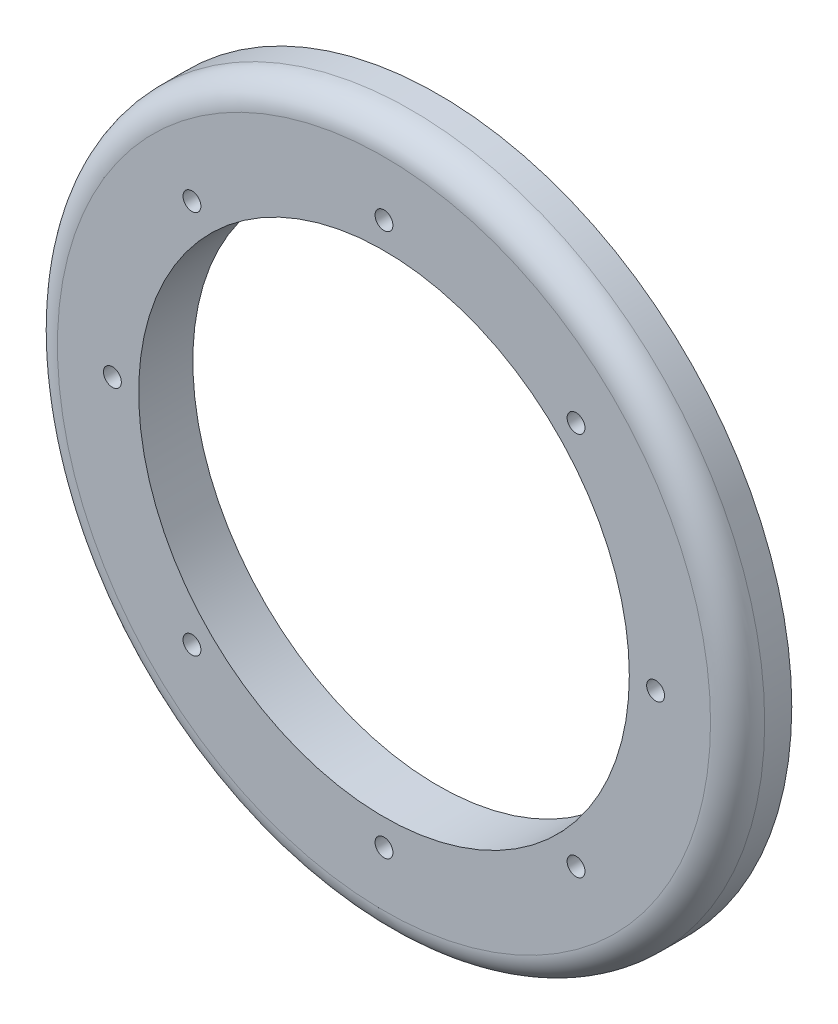
ISO-10303-21;
HEADER;
FILE_DESCRIPTION(('STEP AP214'),'2;1');
FILE_NAME('part.step','',(''),(''),'','','');
FILE_SCHEMA(('AUTOMOTIVE_DESIGN { 1 0 10303 214 1 1 1 1 }'));
ENDSEC;
DATA;
#1=APPLICATION_CONTEXT('core data for automotive mechanical design processes');
#2=APPLICATION_PROTOCOL_DEFINITION('international standard','automotive_design',2000,#1);
#3=PRODUCT_CONTEXT('',#1,'mechanical');
#4=PRODUCT('Part','Part','',(#3));
#5=PRODUCT_RELATED_PRODUCT_CATEGORY('part','',(#4));
#6=PRODUCT_DEFINITION_FORMATION('','',#4);
#7=PRODUCT_DEFINITION_CONTEXT('part definition',#1,'design');
#8=PRODUCT_DEFINITION('design','',#6,#7);
#9=PRODUCT_DEFINITION_SHAPE('','',#8);
#10=(LENGTH_UNIT() NAMED_UNIT(*) SI_UNIT(.MILLI.,.METRE.));
#11=(NAMED_UNIT(*) PLANE_ANGLE_UNIT() SI_UNIT($,.RADIAN.));
#12=(NAMED_UNIT(*) SI_UNIT($,.STERADIAN.) SOLID_ANGLE_UNIT());
#13=UNCERTAINTY_MEASURE_WITH_UNIT(LENGTH_MEASURE(1.E-05),#10,'distance_accuracy_value','');
#14=(GEOMETRIC_REPRESENTATION_CONTEXT(3) GLOBAL_UNCERTAINTY_ASSIGNED_CONTEXT((#13)) GLOBAL_UNIT_ASSIGNED_CONTEXT((#10,
#11,#12)) REPRESENTATION_CONTEXT('',''));
#15=CARTESIAN_POINT('',(0.,0.,0.));
#16=DIRECTION('',(0.,0.,1.));
#17=DIRECTION('',(1.,0.,0.));
#18=AXIS2_PLACEMENT_3D('',#15,#16,#17);
#19=CARTESIAN_POINT('',(0.,0.,10.));
#20=DIRECTION('',(0.,0.,1.));
#21=DIRECTION('',(1.,0.,0.));
#22=AXIS2_PLACEMENT_3D('',#19,#20,#21);
#23=PLANE('',#22);
#24=CARTESIAN_POINT('',(0.,0.,10.));
#25=DIRECTION('',(0.,0.,1.));
#26=DIRECTION('',(1.,0.,0.));
#27=AXIS2_PLACEMENT_3D('',#24,#25,#26);
#28=CIRCLE('',#27,60.3);
#29=CARTESIAN_POINT('',(60.3,0.,10.));
#30=VERTEX_POINT('',#29);
#31=EDGE_CURVE('E42',#30,#30,#28,.T.);
#32=ORIENTED_EDGE('',*,*,#31,.T.);
#33=EDGE_LOOP('',(#32));
#34=FACE_BOUND('',#33,.T.);
#35=CARTESIAN_POINT('',(35.461405076506,35.4614050765047,10.));
#36=DIRECTION('',(0.,0.,1.));
#37=DIRECTION('',(1.,0.,0.));
#38=AXIS2_PLACEMENT_3D('',#35,#36,#37);
#39=CIRCLE('',#38,1.65);
#40=CARTESIAN_POINT('',(37.111405076506,35.4614050765047,10.));
#41=VERTEX_POINT('',#40);
#42=EDGE_CURVE('E92',#41,#41,#39,.T.);
#43=ORIENTED_EDGE('',*,*,#42,.F.);
#44=EDGE_LOOP('',(#43));
#45=FACE_BOUND('',#44,.T.);
#46=CARTESIAN_POINT('',(-35.4614050765048,35.4614050765059,10.));
#47=DIRECTION('',(0.,0.,1.));
#48=DIRECTION('',(1.,0.,0.));
#49=AXIS2_PLACEMENT_3D('',#46,#47,#48);
#50=CIRCLE('',#49,1.65000000000001);
#51=CARTESIAN_POINT('',(-33.8114050765048,35.4614050765059,10.));
#52=VERTEX_POINT('',#51);
#53=EDGE_CURVE('E80',#52,#52,#50,.T.);
#54=ORIENTED_EDGE('',*,*,#53,.F.);
#55=EDGE_LOOP('',(#54));
#56=FACE_BOUND('',#55,.T.);
#57=CARTESIAN_POINT('',(-35.4614050765058,-35.4614050765049,10.));
#58=DIRECTION('',(0.,0.,1.));
#59=DIRECTION('',(1.,0.,0.));
#60=AXIS2_PLACEMENT_3D('',#57,#58,#59);
#61=CIRCLE('',#60,1.65);
#62=CARTESIAN_POINT('',(-33.8114050765058,-35.4614050765049,10.));
#63=VERTEX_POINT('',#62);
#64=EDGE_CURVE('E68',#63,#63,#61,.T.);
#65=ORIENTED_EDGE('',*,*,#64,.F.);
#66=EDGE_LOOP('',(#65));
#67=FACE_BOUND('',#66,.T.);
#68=CARTESIAN_POINT('',(35.4614050765051,-35.4614050765057,10.));
#69=DIRECTION('',(0.,0.,1.));
#70=DIRECTION('',(1.,0.,0.));
#71=AXIS2_PLACEMENT_3D('',#68,#69,#70);
#72=CIRCLE('',#71,1.65);
#73=CARTESIAN_POINT('',(37.1114050765051,-35.4614050765057,10.));
#74=VERTEX_POINT('',#73);
#75=EDGE_CURVE('E56',#74,#74,#72,.T.);
#76=ORIENTED_EDGE('',*,*,#75,.F.);
#77=EDGE_LOOP('',(#76));
#78=FACE_BOUND('',#77,.T.);
#79=CARTESIAN_POINT('',(0.,0.,10.));
#80=DIRECTION('',(0.,0.,1.));
#81=DIRECTION('',(1.,0.,0.));
#82=AXIS2_PLACEMENT_3D('',#79,#80,#81);
#83=CIRCLE('',#82,45.3);
#84=CARTESIAN_POINT('',(45.3,0.,10.));
#85=VERTEX_POINT('',#84);
#86=EDGE_CURVE('E50',#85,#85,#83,.T.);
#87=ORIENTED_EDGE('',*,*,#86,.F.);
#88=EDGE_LOOP('',(#87));
#89=FACE_BOUND('',#88,.T.);
#90=CARTESIAN_POINT('',(-5.20417042793042E-13,-50.15,10.));
#91=DIRECTION('',(0.,0.,1.));
#92=DIRECTION('',(1.,0.,0.));
#93=AXIS2_PLACEMENT_3D('',#90,#91,#92);
#94=CIRCLE('',#93,1.65);
#95=CARTESIAN_POINT('',(1.64999999999948,-50.15,10.));
#96=VERTEX_POINT('',#95);
#97=EDGE_CURVE('E62',#96,#96,#94,.T.);
#98=ORIENTED_EDGE('',*,*,#97,.F.);
#99=EDGE_LOOP('',(#98));
#100=FACE_BOUND('',#99,.T.);
#101=CARTESIAN_POINT('',(-50.15,6.90419943438769E-13,10.));
#102=DIRECTION('',(0.,0.,1.));
#103=DIRECTION('',(1.,0.,0.));
#104=AXIS2_PLACEMENT_3D('',#101,#102,#103);
#105=CIRCLE('',#104,1.65);
#106=CARTESIAN_POINT('',(-48.5,6.90419943438769E-13,10.));
#107=VERTEX_POINT('',#106);
#108=EDGE_CURVE('E74',#107,#107,#105,.T.);
#109=ORIENTED_EDGE('',*,*,#108,.F.);
#110=EDGE_LOOP('',(#109));
#111=FACE_BOUND('',#110,.T.);
#112=CARTESIAN_POINT('',(8.50014503228635E-13,50.15,10.));
#113=DIRECTION('',(0.,0.,1.));
#114=DIRECTION('',(1.,0.,0.));
#115=AXIS2_PLACEMENT_3D('',#112,#113,#114);
#116=CIRCLE('',#115,1.65);
#117=CARTESIAN_POINT('',(1.65000000000085,50.15,10.));
#118=VERTEX_POINT('',#117);
#119=EDGE_CURVE('E86',#118,#118,#116,.T.);
#120=ORIENTED_EDGE('',*,*,#119,.F.);
#121=EDGE_LOOP('',(#120));
#122=FACE_BOUND('',#121,.T.);
#123=CARTESIAN_POINT('',(50.15,-1.03736463863413E-12,10.));
#124=DIRECTION('',(0.,0.,1.));
#125=DIRECTION('',(1.,0.,0.));
#126=AXIS2_PLACEMENT_3D('',#123,#124,#125);
#127=CIRCLE('',#126,1.65);
#128=CARTESIAN_POINT('',(51.8,-1.03736463863413E-12,10.));
#129=VERTEX_POINT('',#128);
#130=EDGE_CURVE('E98',#129,#129,#127,.T.);
#131=ORIENTED_EDGE('',*,*,#130,.F.);
#132=EDGE_LOOP('',(#131));
#133=FACE_BOUND('',#132,.T.);
#134=ADVANCED_FACE('F35',(#34,#45,#56,#67,#78,#89,#100,#111,#122,#133),#23,.T.);
#135=CARTESIAN_POINT('',(0.,0.,0.));
#136=DIRECTION('',(0.,0.,1.));
#137=DIRECTION('',(1.,0.,0.));
#138=AXIS2_PLACEMENT_3D('',#135,#136,#137);
#139=PLANE('',#138);
#140=CARTESIAN_POINT('',(0.,0.,0.));
#141=DIRECTION('',(0.,0.,1.));
#142=DIRECTION('',(1.,0.,0.));
#143=AXIS2_PLACEMENT_3D('',#140,#141,#142);
#144=CIRCLE('',#143,65.3);
#145=CARTESIAN_POINT('',(65.3,0.,0.));
#146=VERTEX_POINT('',#145);
#147=EDGE_CURVE('E46',#146,#146,#144,.T.);
#148=ORIENTED_EDGE('',*,*,#147,.F.);
#149=EDGE_LOOP('',(#148));
#150=FACE_BOUND('',#149,.T.);
#151=CARTESIAN_POINT('',(0.,0.,0.));
#152=DIRECTION('',(0.,0.,1.));
#153=DIRECTION('',(1.,0.,0.));
#154=AXIS2_PLACEMENT_3D('',#151,#152,#153);
#155=CIRCLE('',#154,45.3);
#156=CARTESIAN_POINT('',(45.3,0.,0.));
#157=VERTEX_POINT('',#156);
#158=EDGE_CURVE('E53',#157,#157,#155,.T.);
#159=ORIENTED_EDGE('',*,*,#158,.T.);
#160=EDGE_LOOP('',(#159));
#161=FACE_BOUND('',#160,.T.);
#162=CARTESIAN_POINT('',(35.4614050765051,-35.4614050765057,0.));
#163=DIRECTION('',(0.,0.,1.));
#164=DIRECTION('',(1.,0.,0.));
#165=AXIS2_PLACEMENT_3D('',#162,#163,#164);
#166=CIRCLE('',#165,1.65);
#167=CARTESIAN_POINT('',(37.1114050765051,-35.4614050765057,0.));
#168=VERTEX_POINT('',#167);
#169=EDGE_CURVE('E59',#168,#168,#166,.T.);
#170=ORIENTED_EDGE('',*,*,#169,.T.);
#171=EDGE_LOOP('',(#170));
#172=FACE_BOUND('',#171,.T.);
#173=CARTESIAN_POINT('',(-5.20417042793042E-13,-50.15,0.));
#174=DIRECTION('',(0.,0.,1.));
#175=DIRECTION('',(1.,0.,0.));
#176=AXIS2_PLACEMENT_3D('',#173,#174,#175);
#177=CIRCLE('',#176,1.65);
#178=CARTESIAN_POINT('',(1.64999999999948,-50.15,0.));
#179=VERTEX_POINT('',#178);
#180=EDGE_CURVE('E65',#179,#179,#177,.T.);
#181=ORIENTED_EDGE('',*,*,#180,.T.);
#182=EDGE_LOOP('',(#181));
#183=FACE_BOUND('',#182,.T.);
#184=CARTESIAN_POINT('',(-35.4614050765058,-35.4614050765049,0.));
#185=DIRECTION('',(0.,0.,1.));
#186=DIRECTION('',(1.,0.,0.));
#187=AXIS2_PLACEMENT_3D('',#184,#185,#186);
#188=CIRCLE('',#187,1.65);
#189=CARTESIAN_POINT('',(-33.8114050765058,-35.4614050765049,0.));
#190=VERTEX_POINT('',#189);
#191=EDGE_CURVE('E71',#190,#190,#188,.T.);
#192=ORIENTED_EDGE('',*,*,#191,.T.);
#193=EDGE_LOOP('',(#192));
#194=FACE_BOUND('',#193,.T.);
#195=CARTESIAN_POINT('',(-50.15,6.90419943438769E-13,0.));
#196=DIRECTION('',(0.,0.,1.));
#197=DIRECTION('',(1.,0.,0.));
#198=AXIS2_PLACEMENT_3D('',#195,#196,#197);
#199=CIRCLE('',#198,1.65);
#200=CARTESIAN_POINT('',(-48.5,6.90419943438769E-13,0.));
#201=VERTEX_POINT('',#200);
#202=EDGE_CURVE('E77',#201,#201,#199,.T.);
#203=ORIENTED_EDGE('',*,*,#202,.T.);
#204=EDGE_LOOP('',(#203));
#205=FACE_BOUND('',#204,.T.);
#206=CARTESIAN_POINT('',(-35.4614050765048,35.4614050765059,0.));
#207=DIRECTION('',(0.,0.,1.));
#208=DIRECTION('',(1.,0.,0.));
#209=AXIS2_PLACEMENT_3D('',#206,#207,#208);
#210=CIRCLE('',#209,1.65000000000001);
#211=CARTESIAN_POINT('',(-33.8114050765048,35.4614050765059,0.));
#212=VERTEX_POINT('',#211);
#213=EDGE_CURVE('E83',#212,#212,#210,.T.);
#214=ORIENTED_EDGE('',*,*,#213,.T.);
#215=EDGE_LOOP('',(#214));
#216=FACE_BOUND('',#215,.T.);
#217=CARTESIAN_POINT('',(8.50014503228635E-13,50.15,0.));
#218=DIRECTION('',(0.,0.,1.));
#219=DIRECTION('',(1.,0.,0.));
#220=AXIS2_PLACEMENT_3D('',#217,#218,#219);
#221=CIRCLE('',#220,1.65);
#222=CARTESIAN_POINT('',(1.65000000000085,50.15,0.));
#223=VERTEX_POINT('',#222);
#224=EDGE_CURVE('E89',#223,#223,#221,.T.);
#225=ORIENTED_EDGE('',*,*,#224,.T.);
#226=EDGE_LOOP('',(#225));
#227=FACE_BOUND('',#226,.T.);
#228=CARTESIAN_POINT('',(35.461405076506,35.4614050765047,0.));
#229=DIRECTION('',(0.,0.,1.));
#230=DIRECTION('',(1.,0.,0.));
#231=AXIS2_PLACEMENT_3D('',#228,#229,#230);
#232=CIRCLE('',#231,1.65);
#233=CARTESIAN_POINT('',(37.111405076506,35.4614050765047,0.));
#234=VERTEX_POINT('',#233);
#235=EDGE_CURVE('E95',#234,#234,#232,.T.);
#236=ORIENTED_EDGE('',*,*,#235,.T.);
#237=EDGE_LOOP('',(#236));
#238=FACE_BOUND('',#237,.T.);
#239=CARTESIAN_POINT('',(50.15,-1.03736463863413E-12,0.));
#240=DIRECTION('',(0.,0.,1.));
#241=DIRECTION('',(1.,0.,0.));
#242=AXIS2_PLACEMENT_3D('',#239,#240,#241);
#243=CIRCLE('',#242,1.65);
#244=CARTESIAN_POINT('',(51.8,-1.03736463863413E-12,0.));
#245=VERTEX_POINT('',#244);
#246=EDGE_CURVE('E101',#245,#245,#243,.T.);
#247=ORIENTED_EDGE('',*,*,#246,.T.);
#248=EDGE_LOOP('',(#247));
#249=FACE_BOUND('',#248,.T.);
#250=ADVANCED_FACE('F111',(#150,#161,#172,#183,#194,#205,#216,#227,#238,#249),#139,.F.);
#251=CARTESIAN_POINT('',(0.,0.,10.));
#252=DIRECTION('',(0.,0.,-1.));
#253=DIRECTION('',(-1.,0.,0.));
#254=AXIS2_PLACEMENT_3D('',#251,#252,#253);
#255=CYLINDRICAL_SURFACE('',#254,65.3);
#256=CARTESIAN_POINT('',(0.,0.,5.));
#257=DIRECTION('',(0.,0.,1.));
#258=DIRECTION('',(1.,0.,0.));
#259=AXIS2_PLACEMENT_3D('',#256,#257,#258);
#260=CIRCLE('',#259,65.3);
#261=CARTESIAN_POINT('',(65.3,0.,5.));
#262=VERTEX_POINT('',#261);
#263=EDGE_CURVE('E10',#262,#262,#260,.F.);
#264=ORIENTED_EDGE('',*,*,#263,.T.);
#265=EDGE_LOOP('',(#264));
#266=FACE_BOUND('',#265,.T.);
#267=ORIENTED_EDGE('',*,*,#147,.T.);
#268=EDGE_LOOP('',(#267));
#269=FACE_BOUND('',#268,.T.);
#270=ADVANCED_FACE('F116',(#266,#269),#255,.T.);
#271=CARTESIAN_POINT('',(0.,0.,10.));
#272=DIRECTION('',(0.,0.,-1.));
#273=DIRECTION('',(-1.,0.,0.));
#274=AXIS2_PLACEMENT_3D('',#271,#272,#273);
#275=CYLINDRICAL_SURFACE('',#274,45.3);
#276=ORIENTED_EDGE('',*,*,#86,.T.);
#277=EDGE_LOOP('',(#276));
#278=FACE_BOUND('',#277,.T.);
#279=ORIENTED_EDGE('',*,*,#158,.F.);
#280=EDGE_LOOP('',(#279));
#281=FACE_BOUND('',#280,.T.);
#282=ADVANCED_FACE('F121',(#278,#281),#275,.F.);
#283=CARTESIAN_POINT('',(35.4614050765051,-35.4614050765057,10.));
#284=DIRECTION('',(0.,0.,-1.));
#285=DIRECTION('',(-1.,0.,0.));
#286=AXIS2_PLACEMENT_3D('',#283,#284,#285);
#287=CYLINDRICAL_SURFACE('',#286,1.65);
#288=ORIENTED_EDGE('',*,*,#75,.T.);
#289=EDGE_LOOP('',(#288));
#290=FACE_BOUND('',#289,.T.);
#291=ORIENTED_EDGE('',*,*,#169,.F.);
#292=EDGE_LOOP('',(#291));
#293=FACE_BOUND('',#292,.T.);
#294=ADVANCED_FACE('F127',(#290,#293),#287,.F.);
#295=CARTESIAN_POINT('',(-5.20417042793042E-13,-50.15,10.));
#296=DIRECTION('',(0.,0.,-1.));
#297=DIRECTION('',(-1.,0.,0.));
#298=AXIS2_PLACEMENT_3D('',#295,#296,#297);
#299=CYLINDRICAL_SURFACE('',#298,1.65);
#300=ORIENTED_EDGE('',*,*,#97,.T.);
#301=EDGE_LOOP('',(#300));
#302=FACE_BOUND('',#301,.T.);
#303=ORIENTED_EDGE('',*,*,#180,.F.);
#304=EDGE_LOOP('',(#303));
#305=FACE_BOUND('',#304,.T.);
#306=ADVANCED_FACE('F175',(#302,#305),#299,.F.);
#307=CARTESIAN_POINT('',(-35.4614050765058,-35.4614050765049,10.));
#308=DIRECTION('',(0.,0.,-1.));
#309=DIRECTION('',(-1.,0.,0.));
#310=AXIS2_PLACEMENT_3D('',#307,#308,#309);
#311=CYLINDRICAL_SURFACE('',#310,1.65);
#312=ORIENTED_EDGE('',*,*,#64,.T.);
#313=EDGE_LOOP('',(#312));
#314=FACE_BOUND('',#313,.T.);
#315=ORIENTED_EDGE('',*,*,#191,.F.);
#316=EDGE_LOOP('',(#315));
#317=FACE_BOUND('',#316,.T.);
#318=ADVANCED_FACE('F171',(#314,#317),#311,.F.);
#319=CARTESIAN_POINT('',(-50.15,6.90419943438769E-13,10.));
#320=DIRECTION('',(0.,0.,-1.));
#321=DIRECTION('',(-1.,0.,0.));
#322=AXIS2_PLACEMENT_3D('',#319,#320,#321);
#323=CYLINDRICAL_SURFACE('',#322,1.65);
#324=ORIENTED_EDGE('',*,*,#108,.T.);
#325=EDGE_LOOP('',(#324));
#326=FACE_BOUND('',#325,.T.);
#327=ORIENTED_EDGE('',*,*,#202,.F.);
#328=EDGE_LOOP('',(#327));
#329=FACE_BOUND('',#328,.T.);
#330=ADVANCED_FACE('F167',(#326,#329),#323,.F.);
#331=CARTESIAN_POINT('',(-35.4614050765048,35.4614050765059,10.));
#332=DIRECTION('',(0.,0.,-1.));
#333=DIRECTION('',(-1.,0.,0.));
#334=AXIS2_PLACEMENT_3D('',#331,#332,#333);
#335=CYLINDRICAL_SURFACE('',#334,1.65000000000001);
#336=ORIENTED_EDGE('',*,*,#53,.T.);
#337=EDGE_LOOP('',(#336));
#338=FACE_BOUND('',#337,.T.);
#339=ORIENTED_EDGE('',*,*,#213,.F.);
#340=EDGE_LOOP('',(#339));
#341=FACE_BOUND('',#340,.T.);
#342=ADVANCED_FACE('F163',(#338,#341),#335,.F.);
#343=CARTESIAN_POINT('',(8.50014503228635E-13,50.15,10.));
#344=DIRECTION('',(0.,0.,-1.));
#345=DIRECTION('',(-1.,0.,0.));
#346=AXIS2_PLACEMENT_3D('',#343,#344,#345);
#347=CYLINDRICAL_SURFACE('',#346,1.65);
#348=ORIENTED_EDGE('',*,*,#119,.T.);
#349=EDGE_LOOP('',(#348));
#350=FACE_BOUND('',#349,.T.);
#351=ORIENTED_EDGE('',*,*,#224,.F.);
#352=EDGE_LOOP('',(#351));
#353=FACE_BOUND('',#352,.T.);
#354=ADVANCED_FACE('F157',(#350,#353),#347,.F.);
#355=CARTESIAN_POINT('',(35.461405076506,35.4614050765047,10.));
#356=DIRECTION('',(0.,0.,-1.));
#357=DIRECTION('',(-1.,0.,0.));
#358=AXIS2_PLACEMENT_3D('',#355,#356,#357);
#359=CYLINDRICAL_SURFACE('',#358,1.65);
#360=ORIENTED_EDGE('',*,*,#42,.T.);
#361=EDGE_LOOP('',(#360));
#362=FACE_BOUND('',#361,.T.);
#363=ORIENTED_EDGE('',*,*,#235,.F.);
#364=EDGE_LOOP('',(#363));
#365=FACE_BOUND('',#364,.T.);
#366=ADVANCED_FACE('F150',(#362,#365),#359,.F.);
#367=CARTESIAN_POINT('',(50.15,-1.03736463863413E-12,10.));
#368=DIRECTION('',(0.,0.,-1.));
#369=DIRECTION('',(-1.,0.,0.));
#370=AXIS2_PLACEMENT_3D('',#367,#368,#369);
#371=CYLINDRICAL_SURFACE('',#370,1.65);
#372=ORIENTED_EDGE('',*,*,#130,.T.);
#373=EDGE_LOOP('',(#372));
#374=FACE_BOUND('',#373,.T.);
#375=ORIENTED_EDGE('',*,*,#246,.F.);
#376=EDGE_LOOP('',(#375));
#377=FACE_BOUND('',#376,.T.);
#378=ADVANCED_FACE('F107',(#374,#377),#371,.F.);
#379=CARTESIAN_POINT('',(0.,0.,5.));
#380=DIRECTION('',(0.,0.,1.));
#381=DIRECTION('',(1.,0.,0.));
#382=AXIS2_PLACEMENT_3D('',#379,#380,#381);
#383=TOROIDAL_SURFACE('',#382,60.3,5.);
#384=ORIENTED_EDGE('',*,*,#263,.F.);
#385=EDGE_LOOP('',(#384));
#386=FACE_BOUND('',#385,.T.);
#387=ORIENTED_EDGE('',*,*,#31,.F.);
#388=EDGE_LOOP('',(#387));
#389=FACE_BOUND('',#388,.T.);
#390=ADVANCED_FACE('F37',(#386,#389),#383,.T.);
#391=CLOSED_SHELL('',(#134,#250,#270,#282,#294,#306,#318,#330,#342,#354,#366,#378,#390));
#392=MANIFOLD_SOLID_BREP('B2',#391);
#393=ADVANCED_BREP_SHAPE_REPRESENTATION('',(#18,#392),#14);
#394=SHAPE_DEFINITION_REPRESENTATION(#9,#393);
ENDSEC;
END-ISO-10303-21;
